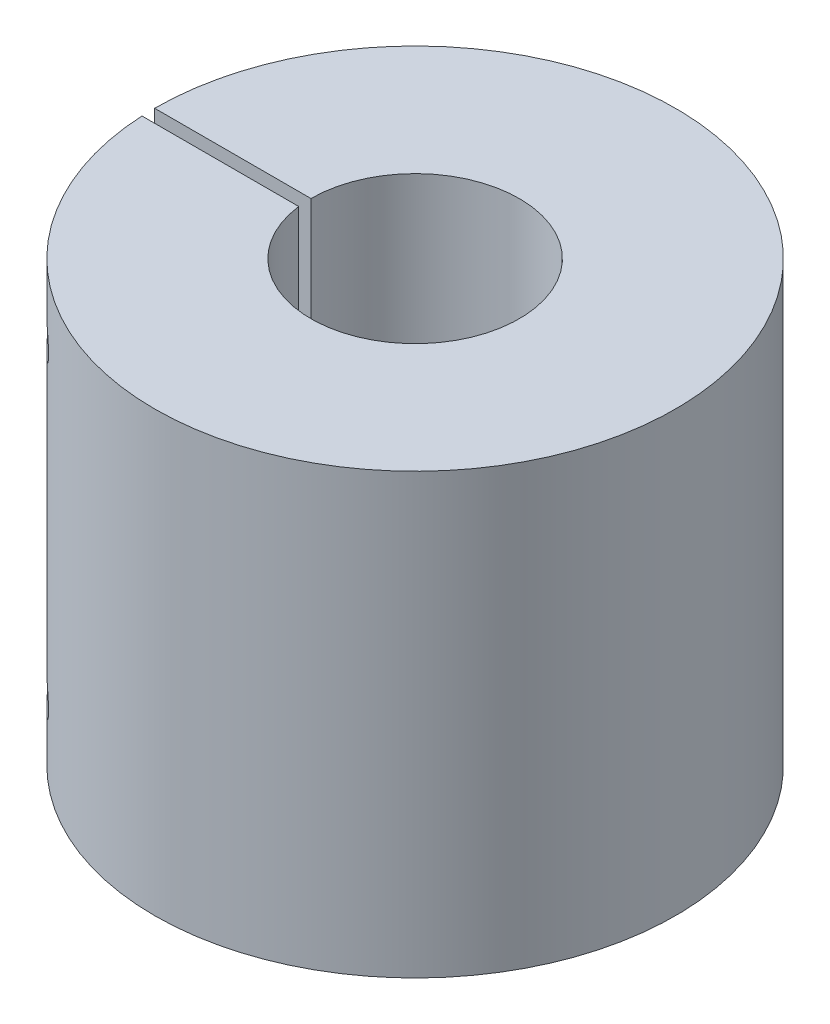
ISO-10303-21;
HEADER;
FILE_DESCRIPTION(('STEP AP214'),'2;1');
FILE_NAME('part.step','',(''),(''),'','','');
FILE_SCHEMA(('AUTOMOTIVE_DESIGN { 1 0 10303 214 1 1 1 1 }'));
ENDSEC;
DATA;
#1=APPLICATION_CONTEXT('core data for automotive mechanical design processes');
#2=APPLICATION_PROTOCOL_DEFINITION('international standard','automotive_design',2000,#1);
#3=PRODUCT_CONTEXT('',#1,'mechanical');
#4=PRODUCT('Part','Part','',(#3));
#5=PRODUCT_RELATED_PRODUCT_CATEGORY('part','',(#4));
#6=PRODUCT_DEFINITION_FORMATION('','',#4);
#7=PRODUCT_DEFINITION_CONTEXT('part definition',#1,'design');
#8=PRODUCT_DEFINITION('design','',#6,#7);
#9=PRODUCT_DEFINITION_SHAPE('','',#8);
#10=(LENGTH_UNIT() NAMED_UNIT(*) SI_UNIT(.MILLI.,.METRE.));
#11=(NAMED_UNIT(*) PLANE_ANGLE_UNIT() SI_UNIT($,.RADIAN.));
#12=(NAMED_UNIT(*) SI_UNIT($,.STERADIAN.) SOLID_ANGLE_UNIT());
#13=UNCERTAINTY_MEASURE_WITH_UNIT(LENGTH_MEASURE(1.E-05),#10,'distance_accuracy_value','');
#14=(GEOMETRIC_REPRESENTATION_CONTEXT(3) GLOBAL_UNCERTAINTY_ASSIGNED_CONTEXT((#13)) GLOBAL_UNIT_ASSIGNED_CONTEXT((#10,
#11,#12)) REPRESENTATION_CONTEXT('',''));
#15=CARTESIAN_POINT('',(0.,0.,0.));
#16=DIRECTION('',(0.,0.,1.));
#17=DIRECTION('',(1.,0.,0.));
#18=AXIS2_PLACEMENT_3D('',#15,#16,#17);
#19=CARTESIAN_POINT('',(0.,42.799,0.));
#20=DIRECTION('',(0.,-1.,0.));
#21=DIRECTION('',(0.,0.,-1.));
#22=AXIS2_PLACEMENT_3D('',#19,#20,#21);
#23=CYLINDRICAL_SURFACE('',#22,25.4);
#24=CARTESIAN_POINT('',(0.,42.799,0.));
#25=DIRECTION('',(0.,1.,0.));
#26=DIRECTION('',(0.,0.,1.));
#27=AXIS2_PLACEMENT_3D('',#24,#25,#26);
#28=CIRCLE('',#27,25.4);
#29=CARTESIAN_POINT('',(-25.3682301314065,42.799,1.26999999999999));
#30=VERTEX_POINT('',#29);
#31=CARTESIAN_POINT('',(-25.4,42.799,0.));
#32=VERTEX_POINT('',#31);
#33=EDGE_CURVE('E11',#30,#32,#28,.T.);
#34=ORIENTED_EDGE('',*,*,#33,.F.);
#35=DIRECTION('',(0.,1.,0.));
#36=VECTOR('',#35,1.);
#37=CARTESIAN_POINT('',(-25.3682301314065,0.,1.26999999999999));
#38=LINE('',#37,#36);
#39=CARTESIAN_POINT('',(-25.3682301314065,0.,1.26999999999999));
#40=VERTEX_POINT('',#39);
#41=EDGE_CURVE('E114',#40,#30,#38,.T.);
#42=ORIENTED_EDGE('',*,*,#41,.F.);
#43=CARTESIAN_POINT('',(0.,0.,0.));
#44=DIRECTION('',(0.,1.,0.));
#45=DIRECTION('',(0.,0.,1.));
#46=AXIS2_PLACEMENT_3D('',#43,#44,#45);
#47=CIRCLE('',#46,25.4);
#48=CARTESIAN_POINT('',(-25.4,0.,0.));
#49=VERTEX_POINT('',#48);
#50=EDGE_CURVE('E47',#40,#49,#47,.T.);
#51=ORIENTED_EDGE('',*,*,#50,.T.);
#52=DIRECTION('',(0.,1.,0.));
#53=VECTOR('',#52,1.);
#54=CARTESIAN_POINT('',(-25.4,0.,0.));
#55=LINE('',#54,#53);
#56=EDGE_CURVE('E55',#49,#32,#55,.T.);
#57=ORIENTED_EDGE('',*,*,#56,.T.);
#58=EDGE_LOOP('',(#34,#42,#51,#57));
#59=FACE_BOUND('',#58,.T.);
#60=CARTESIAN_POINT('',(-19.431,6.35,-16.358369081299));
#61=CARTESIAN_POINT('',(-19.4309944192309,6.42038913939797,-16.3583761695401));
#62=CARTESIAN_POINT('',(-19.4264439889854,6.49091727854745,-16.3637855273968));
#63=CARTESIAN_POINT('',(-19.4086961114471,6.629393930771,-16.3848311349153));
#64=CARTESIAN_POINT('',(-19.3954718971088,6.69733376747083,-16.4004990418976));
#65=CARTESIAN_POINT('',(-19.3617383549631,6.8279243577257,-16.4403087095693));
#66=CARTESIAN_POINT('',(-19.3413017627716,6.89062045682705,-16.4643658385845));
#67=CARTESIAN_POINT('',(-19.2944884436646,7.01051176344823,-16.5192015118006));
#68=CARTESIAN_POINT('',(-19.2681113963587,7.06770667403131,-16.5499804185287));
#69=CARTESIAN_POINT('',(-19.1956482468627,7.2046834228277,-16.6340471934122));
#70=CARTESIAN_POINT('',(-19.1464475588171,7.28073651162879,-16.6907149288399));
#71=CARTESIAN_POINT('',(-19.0402303673137,7.420205069082,-16.8117869073829));
#72=CARTESIAN_POINT('',(-18.9831926522795,7.48358505308802,-16.8762120860691));
#73=CARTESIAN_POINT('',(-18.8360987732611,7.62478463991348,-17.0404918015782));
#74=CARTESIAN_POINT('',(-18.7428365653432,7.69603217093641,-17.1431178761448));
#75=CARTESIAN_POINT('',(-18.5481810274297,7.8158679152501,-17.3535487328191));
#76=CARTESIAN_POINT('',(-18.446779835949,7.86443390402254,-17.461358480573));
#77=CARTESIAN_POINT('',(-18.235094658009,7.94114374480395,-17.6823479824953));
#78=CARTESIAN_POINT('',(-18.1246334252736,7.96861385756088,-17.7955909323108));
#79=CARTESIAN_POINT('',(-17.8999560332912,8.00053903546742,-18.0215691218348));
#80=CARTESIAN_POINT('',(-17.7857406063101,8.00499856239983,-18.1343044557346));
#81=CARTESIAN_POINT('',(-17.5596467157723,7.99002172557805,-18.3532772740552));
#82=CARTESIAN_POINT('',(-17.4478099761869,7.97134332368941,-18.459607312759));
#83=CARTESIAN_POINT('',(-17.2258493229759,7.90947484338186,-18.6668973843933));
#84=CARTESIAN_POINT('',(-17.1157237257143,7.86631066355189,-18.7678629681003));
#85=CARTESIAN_POINT('',(-16.9288771518189,7.76758094504546,-18.936333724112));
#86=CARTESIAN_POINT('',(-16.8507906206837,7.7179719468778,-19.0058125830254));
#87=CARTESIAN_POINT('',(-16.7006518099057,7.60288679689158,-19.1378724903426));
#88=CARTESIAN_POINT('',(-16.6285914588975,7.53743234148047,-19.2004628018765));
#89=CARTESIAN_POINT('',(-16.5081296460805,7.40563617126936,-19.3040569309257));
#90=CARTESIAN_POINT('',(-16.4579317419414,7.34234161853876,-19.3468378952065));
#91=CARTESIAN_POINT('',(-16.3657598787184,7.20585222915891,-19.4248691656344));
#92=CARTESIAN_POINT('',(-16.3237770010859,7.13266827644855,-19.4601276422838));
#93=CARTESIAN_POINT('',(-16.256074531184,6.98933309091186,-19.5167029362595));
#94=CARTESIAN_POINT('',(-16.2288532560677,6.92040973120477,-19.5393239387277));
#95=CARTESIAN_POINT('',(-16.1835790284205,6.77759902915757,-19.5768393880788));
#96=CARTESIAN_POINT('',(-16.1655218630934,6.70371398545375,-19.591737385341));
#97=CARTESIAN_POINT('',(-16.1396849864033,6.55263628161864,-19.6130277648507));
#98=CARTESIAN_POINT('',(-16.1319468931475,6.47543151603526,-19.619385704722));
#99=CARTESIAN_POINT('',(-16.1274465773323,6.32048792152384,-19.6230853320824));
#100=CARTESIAN_POINT('',(-16.1306825934868,6.24274918029455,-19.6204284663997));
#101=CARTESIAN_POINT('',(-16.1472796260072,6.09467702936974,-19.606770732272));
#102=CARTESIAN_POINT('',(-16.1599199569746,6.02420488756877,-19.5963637318054));
#103=CARTESIAN_POINT('',(-16.193720939138,5.88683041270956,-19.5684408863313));
#104=CARTESIAN_POINT('',(-16.2148821149417,5.81992829973658,-19.5509246036222));
#105=CARTESIAN_POINT('',(-16.2657608814974,5.6881092155345,-19.5086175332043));
#106=CARTESIAN_POINT('',(-16.2958252431192,5.62342261337431,-19.483530936649));
#107=CARTESIAN_POINT('',(-16.3626428900298,5.50040581072355,-19.4274502794792));
#108=CARTESIAN_POINT('',(-16.3993999636073,5.4420792402627,-19.3964528726851));
#109=CARTESIAN_POINT('',(-16.4949812829958,5.30894696313849,-19.3153042550792));
#110=CARTESIAN_POINT('',(-16.5565505216774,5.23765230430488,-19.2626071233538));
#111=CARTESIAN_POINT('',(-16.6870498956151,5.10915898676146,-19.149669969492));
#112=CARTESIAN_POINT('',(-16.7559942271395,5.05198824107243,-19.0894153601308));
#113=CARTESIAN_POINT('',(-16.9210744446752,4.93535044919927,-18.9434113532749));
#114=CARTESIAN_POINT('',(-17.0189194946431,4.88086426327358,-18.8556215127556));
#115=CARTESIAN_POINT('',(-17.2182728969005,4.79367972282534,-18.6737624070568));
#116=CARTESIAN_POINT('',(-17.3197853124399,4.76100636798178,-18.5796860722515));
#117=CARTESIAN_POINT('',(-17.5491642419944,4.7100093221386,-18.363480384219));
#118=CARTESIAN_POINT('',(-17.6772463574473,4.69735071467347,-18.2402396609507));
#119=CARTESIAN_POINT('',(-17.9306322431585,4.70099640365768,-17.9912243175881));
#120=CARTESIAN_POINT('',(-18.0559313026397,4.71734650446385,-17.8654460007544));
#121=CARTESIAN_POINT('',(-18.301658764021,4.77842890818427,-17.6136414250719));
#122=CARTESIAN_POINT('',(-18.4220374281642,4.82339839996128,-17.4876219539185));
#123=CARTESIAN_POINT('',(-18.5952187626611,4.91284251301635,-17.3027465166181));
#124=CARTESIAN_POINT('',(-18.6516856540409,4.94629769508168,-17.2418461102654));
#125=CARTESIAN_POINT('',(-18.7616491095533,5.02087332103941,-17.1221231293952));
#126=CARTESIAN_POINT('',(-18.815147685103,5.06198848989693,-17.0632991579064));
#127=CARTESIAN_POINT('',(-18.9265895522988,5.15943432243413,-16.939662702037));
#128=CARTESIAN_POINT('',(-18.983912116456,5.21714034515711,-16.8753598332947));
#129=CARTESIAN_POINT('',(-19.0919434609427,5.34424450593736,-16.7530392088177));
#130=CARTESIAN_POINT('',(-19.1426620694918,5.4136249087121,-16.6950121355577));
#131=CARTESIAN_POINT('',(-19.2241387520574,5.54697608906076,-16.6010665846287));
#132=CARTESIAN_POINT('',(-19.2567849152295,5.60837471546861,-16.5631593962992));
#133=CARTESIAN_POINT('',(-19.3151800185093,5.73838056044018,-16.4950244794823));
#134=CARTESIAN_POINT('',(-19.3409362963926,5.80698000075774,-16.4647885828001));
#135=CARTESIAN_POINT('',(-19.3794967176218,5.93642332807176,-16.4193733331422));
#136=CARTESIAN_POINT('',(-19.393846307626,5.99617650515103,-16.4024086142328));
#137=CARTESIAN_POINT('',(-19.4158601231343,6.11849261052838,-16.3763449726639));
#138=CARTESIAN_POINT('',(-19.4235431277185,6.18104712086391,-16.3672239557609));
#139=CARTESIAN_POINT('',(-19.4287308889301,6.26167392290131,-16.3610640514799));
#140=CARTESIAN_POINT('',(-19.4295804243227,6.27930980557605,-16.3600551862732));
#141=CARTESIAN_POINT('',(-19.4307157306884,6.31462752718393,-16.3587067516462));
#142=CARTESIAN_POINT('',(-19.4310014025928,6.33230937364638,-16.3583672998392));
#143=CARTESIAN_POINT('',(-19.431,6.35,-16.358369081299));
#144=B_SPLINE_CURVE_WITH_KNOTS('',3,(#60,#61,#62,#63,#64,#65,#66,#67,#68,#69,#70,#71,#72,#73,
#74,#75,#76,#77,#78,#79,#80,#81,#82,#83,#84,#85,#86,#87,#88,#89,#90,#91,#92,#93,#94,#95,#96,#97,
#98,#99,#100,#101,#102,#103,#104,#105,#106,#107,#108,#109,#110,#111,#112,#113,#114,#115,#116,
#117,#118,#119,#120,#121,#122,#123,#124,#125,#126,#127,#128,#129,#130,#131,#132,#133,#134,#135,
#136,#137,#138,#139,#140,#141,#142,#143),.UNSPECIFIED.,.T.,.F.,(4,2,2,2,2,2,2,2,2,2,2,2,2,2,2,2,
2,2,2,2,2,2,2,2,2,2,2,2,2,2,2,2,2,2,2,2,2,2,2,2,2,4),(0.,0.211077897864224,0.422810260209689,
0.632465640174069,0.842132330329687,1.16087368933245,1.48049539628029,1.94569905682483,
2.41135759592017,2.89133188003921,3.37121309301595,3.83578160341114,4.29985965378799,
4.6457672037496,4.99120377208246,5.26441220144226,5.53732235925553,5.76877852606434,
6.00012819448879,6.23240813121967,6.4646507900242,6.68072256077282,6.89680763656907,
7.12276576462904,7.34885219206898,7.67088478425751,7.99354880618227,8.41815223896184,
8.84324147797967,9.37509533949432,9.90778973857059,10.4449574823973,10.7132455878386,
10.9813496155824,11.2915429703924,11.6012692765505,11.8380747655534,12.0746270418278,
12.2651195654166,12.4550737329105,12.5081137950801,12.5611631753476),.UNSPECIFIED.);
#145=CARTESIAN_POINT('',(-19.431,6.35,-16.358369081299));
#146=VERTEX_POINT('',#145);
#147=EDGE_CURVE('E125',#146,#146,#144,.T.);
#148=ORIENTED_EDGE('',*,*,#147,.F.);
#149=EDGE_LOOP('',(#148));
#150=FACE_BOUND('',#149,.T.);
#151=CARTESIAN_POINT('',(-19.431,6.35,16.358369081299));
#152=CARTESIAN_POINT('',(-19.4309944192309,6.27961086060202,16.3583761695401));
#153=CARTESIAN_POINT('',(-19.4264439889854,6.20908272145255,16.3637855273968));
#154=CARTESIAN_POINT('',(-19.4086961114471,6.07060606922899,16.3848311349153));
#155=CARTESIAN_POINT('',(-19.3954718971088,6.00266623252916,16.4004990418976));
#156=CARTESIAN_POINT('',(-19.3617383549631,5.87207564227429,16.4403087095693));
#157=CARTESIAN_POINT('',(-19.3413017627716,5.80937954317294,16.4643658385845));
#158=CARTESIAN_POINT('',(-19.2944884436646,5.68948823655176,16.5192015118005));
#159=CARTESIAN_POINT('',(-19.2681113963587,5.63229332596868,16.5499804185287));
#160=CARTESIAN_POINT('',(-19.1956482468627,5.49531657717229,16.6340471934122));
#161=CARTESIAN_POINT('',(-19.1464475588171,5.4192634883712,16.6907149288399));
#162=CARTESIAN_POINT('',(-19.0402303673137,5.27979493091799,16.8117869073829));
#163=CARTESIAN_POINT('',(-18.9831926522795,5.21641494691197,16.8762120860691));
#164=CARTESIAN_POINT('',(-18.8360987732611,5.07521536008652,17.0404918015782));
#165=CARTESIAN_POINT('',(-18.7428365653432,5.00396782906358,17.1431178761448));
#166=CARTESIAN_POINT('',(-18.5481810274297,4.88413208474989,17.3535487328191));
#167=CARTESIAN_POINT('',(-18.446779835949,4.83556609597745,17.461358480573));
#168=CARTESIAN_POINT('',(-18.235094658009,4.75885625519604,17.6823479824953));
#169=CARTESIAN_POINT('',(-18.1246334252736,4.73138614243911,17.7955909323108));
#170=CARTESIAN_POINT('',(-17.8999560332912,4.69946096453257,18.0215691218348));
#171=CARTESIAN_POINT('',(-17.7857406063101,4.69500143760015,18.1343044557346));
#172=CARTESIAN_POINT('',(-17.5596467157723,4.70997827442194,18.3532772740552));
#173=CARTESIAN_POINT('',(-17.4478099761869,4.72865667631057,18.459607312759));
#174=CARTESIAN_POINT('',(-17.2258493229759,4.79052515661813,18.6668973843933));
#175=CARTESIAN_POINT('',(-17.1157237257143,4.8336893364481,18.7678629681003));
#176=CARTESIAN_POINT('',(-16.9288771518189,4.93241905495453,18.936333724112));
#177=CARTESIAN_POINT('',(-16.8507906206837,4.98202805312219,19.0058125830254));
#178=CARTESIAN_POINT('',(-16.7006518099057,5.09711320310841,19.1378724903426));
#179=CARTESIAN_POINT('',(-16.6285914588975,5.16256765851953,19.2004628018765));
#180=CARTESIAN_POINT('',(-16.5081296460805,5.29436382873063,19.3040569309257));
#181=CARTESIAN_POINT('',(-16.4579317419414,5.35765838146123,19.3468378952065));
#182=CARTESIAN_POINT('',(-16.3657598787184,5.49414777084108,19.4248691656344));
#183=CARTESIAN_POINT('',(-16.3237770010859,5.56733172355145,19.4601276422838));
#184=CARTESIAN_POINT('',(-16.256074531184,5.71066690908813,19.5167029362595));
#185=CARTESIAN_POINT('',(-16.2288532560677,5.77959026879522,19.5393239387277));
#186=CARTESIAN_POINT('',(-16.1835790284205,5.92240097084242,19.5768393880788));
#187=CARTESIAN_POINT('',(-16.1655218630934,5.99628601454625,19.591737385341));
#188=CARTESIAN_POINT('',(-16.1396849864033,6.14736371838135,19.6130277648507));
#189=CARTESIAN_POINT('',(-16.1319468931475,6.22456848396473,19.619385704722));
#190=CARTESIAN_POINT('',(-16.1274465773323,6.37951207847615,19.6230853320824));
#191=CARTESIAN_POINT('',(-16.1306825934868,6.45725081970544,19.6204284663997));
#192=CARTESIAN_POINT('',(-16.1472796260072,6.60532297063025,19.606770732272));
#193=CARTESIAN_POINT('',(-16.1599199569746,6.67579511243122,19.5963637318054));
#194=CARTESIAN_POINT('',(-16.193720939138,6.81316958729043,19.5684408863313));
#195=CARTESIAN_POINT('',(-16.2148821149417,6.88007170026341,19.5509246036222));
#196=CARTESIAN_POINT('',(-16.2657608814974,7.01189078446549,19.5086175332043));
#197=CARTESIAN_POINT('',(-16.2958252431192,7.07657738662568,19.483530936649));
#198=CARTESIAN_POINT('',(-16.3626428900298,7.19959418927644,19.4274502794792));
#199=CARTESIAN_POINT('',(-16.3993999636073,7.25792075973729,19.3964528726851));
#200=CARTESIAN_POINT('',(-16.4949812829958,7.3910530368615,19.3153042550792));
#201=CARTESIAN_POINT('',(-16.5565505216774,7.46234769569511,19.2626071233538));
#202=CARTESIAN_POINT('',(-16.6870498956151,7.59084101323854,19.149669969492));
#203=CARTESIAN_POINT('',(-16.7559942271395,7.64801175892756,19.0894153601308));
#204=CARTESIAN_POINT('',(-16.9210744446752,7.76464955080072,18.9434113532749));
#205=CARTESIAN_POINT('',(-17.0189194946431,7.81913573672641,18.8556215127556));
#206=CARTESIAN_POINT('',(-17.2182728969005,7.90632027717466,18.6737624070568));
#207=CARTESIAN_POINT('',(-17.3197853124399,7.93899363201821,18.5796860722515));
#208=CARTESIAN_POINT('',(-17.5491642419944,7.98999067786139,18.3634803842191));
#209=CARTESIAN_POINT('',(-17.6772463574473,8.00264928532652,18.2402396609507));
#210=CARTESIAN_POINT('',(-17.9306322431585,7.99900359634232,17.9912243175881));
#211=CARTESIAN_POINT('',(-18.0559313026397,7.98265349553614,17.8654460007544));
#212=CARTESIAN_POINT('',(-18.301658764021,7.92157109181572,17.6136414250719));
#213=CARTESIAN_POINT('',(-18.4220374281642,7.87660160003872,17.4876219539185));
#214=CARTESIAN_POINT('',(-18.5952187626611,7.78715748698365,17.3027465166181));
#215=CARTESIAN_POINT('',(-18.6516856540409,7.75370230491832,17.2418461102654));
#216=CARTESIAN_POINT('',(-18.7616491095533,7.67912667896058,17.1221231293952));
#217=CARTESIAN_POINT('',(-18.815147685103,7.63801151010306,17.0632991579064));
#218=CARTESIAN_POINT('',(-18.9265895522988,7.54056567756587,16.939662702037));
#219=CARTESIAN_POINT('',(-18.983912116456,7.48285965484288,16.8753598332947));
#220=CARTESIAN_POINT('',(-19.0919434609427,7.35575549406263,16.7530392088177));
#221=CARTESIAN_POINT('',(-19.1426620694918,7.28637509128789,16.6950121355577));
#222=CARTESIAN_POINT('',(-19.2241387520574,7.15302391093924,16.6010665846287));
#223=CARTESIAN_POINT('',(-19.2567849152295,7.09162528453139,16.5631593962992));
#224=CARTESIAN_POINT('',(-19.3151800185093,6.96161943955982,16.4950244794823));
#225=CARTESIAN_POINT('',(-19.3409362963926,6.89301999924225,16.4647885828001));
#226=CARTESIAN_POINT('',(-19.3794967176218,6.76357667192824,16.4193733331422));
#227=CARTESIAN_POINT('',(-19.393846307626,6.70382349484897,16.4024086142328));
#228=CARTESIAN_POINT('',(-19.4158601231343,6.58150738947162,16.3763449726639));
#229=CARTESIAN_POINT('',(-19.4235431277185,6.51895287913609,16.3672239557609));
#230=CARTESIAN_POINT('',(-19.4287308889301,6.43832607709869,16.3610640514799));
#231=CARTESIAN_POINT('',(-19.4295804243227,6.42069019442395,16.3600551862732));
#232=CARTESIAN_POINT('',(-19.4307157306884,6.38537247281606,16.3587067516462));
#233=CARTESIAN_POINT('',(-19.4310014025928,6.36769062635361,16.3583672998392));
#234=CARTESIAN_POINT('',(-19.431,6.35,16.358369081299));
#235=B_SPLINE_CURVE_WITH_KNOTS('',3,(#151,#152,#153,#154,#155,#156,#157,#158,#159,#160,#161,
#162,#163,#164,#165,#166,#167,#168,#169,#170,#171,#172,#173,#174,#175,#176,#177,#178,#179,#180,
#181,#182,#183,#184,#185,#186,#187,#188,#189,#190,#191,#192,#193,#194,#195,#196,#197,#198,#199,
#200,#201,#202,#203,#204,#205,#206,#207,#208,#209,#210,#211,#212,#213,#214,#215,#216,#217,#218,
#219,#220,#221,#222,#223,#224,#225,#226,#227,#228,#229,#230,#231,#232,#233,#234),.UNSPECIFIED.,
.T.,.F.,(4,2,2,2,2,2,2,2,2,2,2,2,2,2,2,2,2,2,2,2,2,2,2,2,2,2,2,2,2,2,2,2,2,2,2,2,2,2,2,2,2,4),
(0.,0.211077897864224,0.422810260209689,0.632465640174069,0.842132330329687,1.16087368933245,
1.48049539628029,1.94569905682483,2.41135759592017,2.89133188003921,3.37121309301595,
3.83578160341114,4.29985965378799,4.6457672037496,4.99120377208246,5.26441220144226,
5.53732235925553,5.76877852606434,6.0001281944888,6.23240813121967,6.4646507900242,
6.68072256077282,6.89680763656907,7.12276576462905,7.34885219206898,7.67088478425751,
7.99354880618227,8.41815223896184,8.84324147797967,9.37509533949431,9.90778973857058,
10.4449574823973,10.7132455878386,10.9813496155824,11.2915429703924,11.6012692765505,
11.8380747655534,12.0746270418278,12.2651195654166,12.4550737329105,12.5081137950801,
12.5611631753476),.UNSPECIFIED.);
#236=CARTESIAN_POINT('',(-19.431,6.35,16.358369081299));
#237=VERTEX_POINT('',#236);
#238=EDGE_CURVE('E130',#237,#237,#235,.T.);
#239=ORIENTED_EDGE('',*,*,#238,.F.);
#240=EDGE_LOOP('',(#239));
#241=FACE_BOUND('',#240,.T.);
#242=CARTESIAN_POINT('',(-19.431,36.449,-16.358369081299));
#243=CARTESIAN_POINT('',(-19.4309944192309,36.519389139398,-16.3583761695401));
#244=CARTESIAN_POINT('',(-19.4264439889854,36.5899172785474,-16.3637855273968));
#245=CARTESIAN_POINT('',(-19.4086961114471,36.728393930771,-16.3848311349153));
#246=CARTESIAN_POINT('',(-19.3954718971088,36.7963337674708,-16.4004990418976));
#247=CARTESIAN_POINT('',(-19.3617383549631,36.9269243577257,-16.4403087095693));
#248=CARTESIAN_POINT('',(-19.3413017627716,36.989620456827,-16.4643658385846));
#249=CARTESIAN_POINT('',(-19.2944884436646,37.1095117634482,-16.5192015118006));
#250=CARTESIAN_POINT('',(-19.2681113963587,37.1667066740313,-16.5499804185287));
#251=CARTESIAN_POINT('',(-19.1956482468627,37.3036834228277,-16.6340471934122));
#252=CARTESIAN_POINT('',(-19.1464475588171,37.3797365116288,-16.6907149288399));
#253=CARTESIAN_POINT('',(-19.0402303673137,37.519205069082,-16.8117869073829));
#254=CARTESIAN_POINT('',(-18.9831926522794,37.582585053088,-16.8762120860691));
#255=CARTESIAN_POINT('',(-18.8360987732611,37.7237846399135,-17.0404918015782));
#256=CARTESIAN_POINT('',(-18.7428365653432,37.7950321709364,-17.1431178761448));
#257=CARTESIAN_POINT('',(-18.5481810274297,37.9148679152501,-17.3535487328192));
#258=CARTESIAN_POINT('',(-18.446779835949,37.9634339040225,-17.461358480573));
#259=CARTESIAN_POINT('',(-18.235094658009,38.0401437448039,-17.6823479824953));
#260=CARTESIAN_POINT('',(-18.1246334252736,38.0676138575609,-17.7955909323108));
#261=CARTESIAN_POINT('',(-17.8999560332911,38.0995390354674,-18.0215691218348));
#262=CARTESIAN_POINT('',(-17.78574060631,38.1039985623998,-18.1343044557346));
#263=CARTESIAN_POINT('',(-17.5596467157723,38.089021725578,-18.3532772740552));
#264=CARTESIAN_POINT('',(-17.4478099761869,38.0703433236894,-18.459607312759));
#265=CARTESIAN_POINT('',(-17.2258493229759,38.0084748433818,-18.6668973843933));
#266=CARTESIAN_POINT('',(-17.1157237257143,37.9653106635519,-18.7678629681003));
#267=CARTESIAN_POINT('',(-16.9288771518189,37.8665809450454,-18.9363337241121));
#268=CARTESIAN_POINT('',(-16.8507906206836,37.8169719468778,-19.0058125830254));
#269=CARTESIAN_POINT('',(-16.7006518099057,37.7018867968916,-19.1378724903426));
#270=CARTESIAN_POINT('',(-16.6285914588975,37.6364323414805,-19.2004628018765));
#271=CARTESIAN_POINT('',(-16.5081296460805,37.5046361712693,-19.3040569309257));
#272=CARTESIAN_POINT('',(-16.4579317419414,37.4413416185387,-19.3468378952065));
#273=CARTESIAN_POINT('',(-16.3657598787184,37.3048522291589,-19.4248691656344));
#274=CARTESIAN_POINT('',(-16.3237770010859,37.2316682764485,-19.4601276422838));
#275=CARTESIAN_POINT('',(-16.2560745311839,37.0883330909118,-19.5167029362595));
#276=CARTESIAN_POINT('',(-16.2288532560677,37.0194097312047,-19.5393239387277));
#277=CARTESIAN_POINT('',(-16.1835790284205,36.8765990291576,-19.5768393880788));
#278=CARTESIAN_POINT('',(-16.1655218630934,36.8027139854537,-19.591737385341));
#279=CARTESIAN_POINT('',(-16.1396849864033,36.6516362816186,-19.6130277648507));
#280=CARTESIAN_POINT('',(-16.1319468931475,36.5744315160352,-19.619385704722));
#281=CARTESIAN_POINT('',(-16.1274465773323,36.4194879215238,-19.6230853320824));
#282=CARTESIAN_POINT('',(-16.1306825934868,36.3417491802945,-19.6204284663997));
#283=CARTESIAN_POINT('',(-16.1472796260072,36.1936770293697,-19.606770732272));
#284=CARTESIAN_POINT('',(-16.1599199569746,36.1232048875687,-19.5963637318053));
#285=CARTESIAN_POINT('',(-16.193720939138,35.9858304127095,-19.5684408863313));
#286=CARTESIAN_POINT('',(-16.2148821149417,35.9189282997365,-19.5509246036222));
#287=CARTESIAN_POINT('',(-16.2657608814974,35.7871092155345,-19.5086175332043));
#288=CARTESIAN_POINT('',(-16.2958252431192,35.7224226133743,-19.483530936649));
#289=CARTESIAN_POINT('',(-16.3626428900299,35.5994058107235,-19.4274502794792));
#290=CARTESIAN_POINT('',(-16.3993999636074,35.5410792402627,-19.3964528726851));
#291=CARTESIAN_POINT('',(-16.4949812829958,35.4079469631385,-19.3153042550792));
#292=CARTESIAN_POINT('',(-16.5565505216774,35.3366523043049,-19.2626071233538));
#293=CARTESIAN_POINT('',(-16.6870498956151,35.2081589867614,-19.149669969492));
#294=CARTESIAN_POINT('',(-16.7559942271395,35.1509882410724,-19.0894153601308));
#295=CARTESIAN_POINT('',(-16.9210744446752,35.0343504491993,-18.9434113532749));
#296=CARTESIAN_POINT('',(-17.0189194946431,34.9798642632736,-18.8556215127556));
#297=CARTESIAN_POINT('',(-17.2182728969005,34.8926797228253,-18.6737624070568));
#298=CARTESIAN_POINT('',(-17.3197853124399,34.8600063679818,-18.5796860722515));
#299=CARTESIAN_POINT('',(-17.5491642419944,34.8090093221386,-18.363480384219));
#300=CARTESIAN_POINT('',(-17.6772463574473,34.7963507146735,-18.2402396609507));
#301=CARTESIAN_POINT('',(-17.9306322431585,34.7999964036577,-17.9912243175881));
#302=CARTESIAN_POINT('',(-18.0559313026397,34.8163465044639,-17.8654460007544));
#303=CARTESIAN_POINT('',(-18.301658764021,34.8774289081843,-17.6136414250719));
#304=CARTESIAN_POINT('',(-18.4220374281643,34.9223983999613,-17.4876219539185));
#305=CARTESIAN_POINT('',(-18.5952187626611,35.0118425130164,-17.3027465166181));
#306=CARTESIAN_POINT('',(-18.6516856540409,35.0452976950817,-17.2418461102654));
#307=CARTESIAN_POINT('',(-18.7616491095533,35.1198733210394,-17.1221231293952));
#308=CARTESIAN_POINT('',(-18.815147685103,35.1609884898969,-17.0632991579064));
#309=CARTESIAN_POINT('',(-18.9265895522988,35.2584343224341,-16.939662702037));
#310=CARTESIAN_POINT('',(-18.983912116456,35.3161403451571,-16.8753598332947));
#311=CARTESIAN_POINT('',(-19.0919434609427,35.4432445059374,-16.7530392088177));
#312=CARTESIAN_POINT('',(-19.1426620694918,35.5126249087121,-16.6950121355577));
#313=CARTESIAN_POINT('',(-19.2241387520574,35.6459760890608,-16.6010665846287));
#314=CARTESIAN_POINT('',(-19.2567849152295,35.7073747154686,-16.5631593962992));
#315=CARTESIAN_POINT('',(-19.3151800185093,35.8373805604402,-16.4950244794823));
#316=CARTESIAN_POINT('',(-19.3409362963926,35.9059800007577,-16.4647885828001));
#317=CARTESIAN_POINT('',(-19.3794967176218,36.0354233280718,-16.4193733331422));
#318=CARTESIAN_POINT('',(-19.393846307626,36.095176505151,-16.4024086142328));
#319=CARTESIAN_POINT('',(-19.4158601231343,36.2174926105284,-16.3763449726639));
#320=CARTESIAN_POINT('',(-19.4235431277185,36.2800471208639,-16.3672239557609));
#321=CARTESIAN_POINT('',(-19.4287308889301,36.3606739229013,-16.3610640514799));
#322=CARTESIAN_POINT('',(-19.4295804243227,36.378309805576,-16.3600551862732));
#323=CARTESIAN_POINT('',(-19.4307157306884,36.4136275271839,-16.3587067516462));
#324=CARTESIAN_POINT('',(-19.4310014025928,36.4313093736464,-16.3583672998392));
#325=CARTESIAN_POINT('',(-19.431,36.449,-16.358369081299));
#326=B_SPLINE_CURVE_WITH_KNOTS('',3,(#242,#243,#244,#245,#246,#247,#248,#249,#250,#251,#252,
#253,#254,#255,#256,#257,#258,#259,#260,#261,#262,#263,#264,#265,#266,#267,#268,#269,#270,#271,
#272,#273,#274,#275,#276,#277,#278,#279,#280,#281,#282,#283,#284,#285,#286,#287,#288,#289,#290,
#291,#292,#293,#294,#295,#296,#297,#298,#299,#300,#301,#302,#303,#304,#305,#306,#307,#308,#309,
#310,#311,#312,#313,#314,#315,#316,#317,#318,#319,#320,#321,#322,#323,#324,#325),.UNSPECIFIED.,
.T.,.F.,(4,2,2,2,2,2,2,2,2,2,2,2,2,2,2,2,2,2,2,2,2,2,2,2,2,2,2,2,2,2,2,2,2,2,2,2,2,2,2,2,2,4),
(0.,0.211077897864219,0.422810260209689,0.632465640174072,0.842132330329692,1.16087368933245,
1.48049539628029,1.94569905682483,2.41135759592018,2.89133188003922,3.37121309301595,
3.83578160341114,4.29985965378799,4.6457672037496,4.99120377208246,5.26441220144225,
5.53732235925552,5.76877852606433,6.00012819448879,6.23240813121968,6.4646507900242,
6.68072256077282,6.89680763656907,7.12276576462905,7.34885219206898,7.67088478425751,
7.99354880618227,8.41815223896184,8.84324147797967,9.37509533949432,9.90778973857058,
10.4449574823973,10.7132455878386,10.9813496155824,11.2915429703923,11.6012692765505,
11.8380747655534,12.0746270418277,12.2651195654166,12.4550737329105,12.5081137950801,
12.5611631753476),.UNSPECIFIED.);
#327=CARTESIAN_POINT('',(-19.431,36.449,-16.358369081299));
#328=VERTEX_POINT('',#327);
#329=EDGE_CURVE('E180',#328,#328,#326,.T.);
#330=ORIENTED_EDGE('',*,*,#329,.F.);
#331=EDGE_LOOP('',(#330));
#332=FACE_BOUND('',#331,.T.);
#333=CARTESIAN_POINT('',(-19.431,36.449,16.358369081299));
#334=CARTESIAN_POINT('',(-19.4309944192309,36.378610860602,16.3583761695401));
#335=CARTESIAN_POINT('',(-19.4264439889854,36.3080827214525,16.3637855273968));
#336=CARTESIAN_POINT('',(-19.4086961114471,36.169606069229,16.3848311349153));
#337=CARTESIAN_POINT('',(-19.3954718971088,36.1016662325292,16.4004990418976));
#338=CARTESIAN_POINT('',(-19.3617383549631,35.9710756422743,16.4403087095693));
#339=CARTESIAN_POINT('',(-19.3413017627716,35.9083795431729,16.4643658385846));
#340=CARTESIAN_POINT('',(-19.2944884436646,35.7884882365517,16.5192015118006));
#341=CARTESIAN_POINT('',(-19.2681113963587,35.7312933259687,16.5499804185287));
#342=CARTESIAN_POINT('',(-19.1956482468627,35.5943165771723,16.6340471934122));
#343=CARTESIAN_POINT('',(-19.1464475588171,35.5182634883712,16.6907149288399));
#344=CARTESIAN_POINT('',(-19.0402303673137,35.378794930918,16.8117869073829));
#345=CARTESIAN_POINT('',(-18.9831926522794,35.315414946912,16.8762120860691));
#346=CARTESIAN_POINT('',(-18.8360987732611,35.1742153600865,17.0404918015782));
#347=CARTESIAN_POINT('',(-18.7428365653432,35.1029678290636,17.1431178761448));
#348=CARTESIAN_POINT('',(-18.5481810274297,34.9831320847499,17.3535487328192));
#349=CARTESIAN_POINT('',(-18.446779835949,34.9345660959774,17.461358480573));
#350=CARTESIAN_POINT('',(-18.235094658009,34.857856255196,17.6823479824953));
#351=CARTESIAN_POINT('',(-18.1246334252736,34.8303861424391,17.7955909323108));
#352=CARTESIAN_POINT('',(-17.8999560332911,34.7984609645326,18.0215691218348));
#353=CARTESIAN_POINT('',(-17.78574060631,34.7940014376002,18.1343044557346));
#354=CARTESIAN_POINT('',(-17.5596467157723,34.8089782744219,18.3532772740552));
#355=CARTESIAN_POINT('',(-17.4478099761869,34.8276566763106,18.459607312759));
#356=CARTESIAN_POINT('',(-17.2258493229759,34.8895251566181,18.6668973843933));
#357=CARTESIAN_POINT('',(-17.1157237257143,34.9326893364481,18.7678629681003));
#358=CARTESIAN_POINT('',(-16.9288771518189,35.0314190549545,18.9363337241121));
#359=CARTESIAN_POINT('',(-16.8507906206836,35.0810280531222,19.0058125830254));
#360=CARTESIAN_POINT('',(-16.7006518099057,35.1961132031084,19.1378724903426));
#361=CARTESIAN_POINT('',(-16.6285914588975,35.2615676585195,19.2004628018765));
#362=CARTESIAN_POINT('',(-16.5081296460805,35.3933638287306,19.3040569309257));
#363=CARTESIAN_POINT('',(-16.4579317419414,35.4566583814612,19.3468378952065));
#364=CARTESIAN_POINT('',(-16.3657598787184,35.5931477708411,19.4248691656344));
#365=CARTESIAN_POINT('',(-16.3237770010859,35.6663317235515,19.4601276422838));
#366=CARTESIAN_POINT('',(-16.2560745311839,35.8096669090881,19.5167029362595));
#367=CARTESIAN_POINT('',(-16.2288532560677,35.8785902687952,19.5393239387277));
#368=CARTESIAN_POINT('',(-16.1835790284205,36.0214009708424,19.5768393880788));
#369=CARTESIAN_POINT('',(-16.1655218630934,36.0952860145463,19.591737385341));
#370=CARTESIAN_POINT('',(-16.1396849864033,36.2463637183814,19.6130277648507));
#371=CARTESIAN_POINT('',(-16.1319468931475,36.3235684839647,19.619385704722));
#372=CARTESIAN_POINT('',(-16.1274465773323,36.4785120784762,19.6230853320824));
#373=CARTESIAN_POINT('',(-16.1306825934868,36.5562508197054,19.6204284663997));
#374=CARTESIAN_POINT('',(-16.1472796260072,36.7043229706303,19.606770732272));
#375=CARTESIAN_POINT('',(-16.1599199569746,36.7747951124312,19.5963637318053));
#376=CARTESIAN_POINT('',(-16.193720939138,36.9121695872904,19.5684408863313));
#377=CARTESIAN_POINT('',(-16.2148821149417,36.9790717002634,19.5509246036222));
#378=CARTESIAN_POINT('',(-16.2657608814974,37.1108907844655,19.5086175332043));
#379=CARTESIAN_POINT('',(-16.2958252431192,37.1755773866257,19.483530936649));
#380=CARTESIAN_POINT('',(-16.3626428900299,37.2985941892764,19.4274502794792));
#381=CARTESIAN_POINT('',(-16.3993999636074,37.3569207597373,19.3964528726851));
#382=CARTESIAN_POINT('',(-16.4949812829958,37.4900530368615,19.3153042550792));
#383=CARTESIAN_POINT('',(-16.5565505216774,37.5613476956951,19.2626071233538));
#384=CARTESIAN_POINT('',(-16.6870498956151,37.6898410132385,19.149669969492));
#385=CARTESIAN_POINT('',(-16.7559942271395,37.7470117589276,19.0894153601308));
#386=CARTESIAN_POINT('',(-16.9210744446752,37.8636495508007,18.9434113532749));
#387=CARTESIAN_POINT('',(-17.0189194946431,37.9181357367264,18.8556215127556));
#388=CARTESIAN_POINT('',(-17.2182728969005,38.0053202771747,18.6737624070568));
#389=CARTESIAN_POINT('',(-17.3197853124399,38.0379936320182,18.5796860722515));
#390=CARTESIAN_POINT('',(-17.5491642419944,38.0889906778614,18.363480384219));
#391=CARTESIAN_POINT('',(-17.6772463574473,38.1016492853265,18.2402396609507));
#392=CARTESIAN_POINT('',(-17.9306322431585,38.0980035963423,17.9912243175881));
#393=CARTESIAN_POINT('',(-18.0559313026397,38.0816534955361,17.8654460007544));
#394=CARTESIAN_POINT('',(-18.301658764021,38.0205710918157,17.6136414250719));
#395=CARTESIAN_POINT('',(-18.4220374281643,37.9756016000387,17.4876219539185));
#396=CARTESIAN_POINT('',(-18.5952187626611,37.8861574869836,17.3027465166181));
#397=CARTESIAN_POINT('',(-18.6516856540409,37.8527023049183,17.2418461102654));
#398=CARTESIAN_POINT('',(-18.7616491095533,37.7781266789606,17.1221231293952));
#399=CARTESIAN_POINT('',(-18.815147685103,37.737011510103,17.0632991579064));
#400=CARTESIAN_POINT('',(-18.9265895522988,37.6395656775658,16.939662702037));
#401=CARTESIAN_POINT('',(-18.983912116456,37.5818596548429,16.8753598332947));
#402=CARTESIAN_POINT('',(-19.0919434609427,37.4547554940626,16.7530392088177));
#403=CARTESIAN_POINT('',(-19.1426620694918,37.3853750912879,16.6950121355577));
#404=CARTESIAN_POINT('',(-19.2241387520574,37.2520239109392,16.6010665846287));
#405=CARTESIAN_POINT('',(-19.2567849152295,37.1906252845314,16.5631593962992));
#406=CARTESIAN_POINT('',(-19.3151800185093,37.0606194395598,16.4950244794823));
#407=CARTESIAN_POINT('',(-19.3409362963926,36.9920199992422,16.4647885828001));
#408=CARTESIAN_POINT('',(-19.3794967176218,36.8625766719282,16.4193733331422));
#409=CARTESIAN_POINT('',(-19.393846307626,36.802823494849,16.4024086142328));
#410=CARTESIAN_POINT('',(-19.4158601231343,36.6805073894716,16.3763449726639));
#411=CARTESIAN_POINT('',(-19.4235431277185,36.6179528791361,16.3672239557609));
#412=CARTESIAN_POINT('',(-19.4287308889301,36.5373260770987,16.3610640514799));
#413=CARTESIAN_POINT('',(-19.4295804243227,36.5196901944239,16.3600551862732));
#414=CARTESIAN_POINT('',(-19.4307157306884,36.4843724728161,16.3587067516462));
#415=CARTESIAN_POINT('',(-19.4310014025928,36.4666906263536,16.3583672998392));
#416=CARTESIAN_POINT('',(-19.431,36.449,16.358369081299));
#417=B_SPLINE_CURVE_WITH_KNOTS('',3,(#333,#334,#335,#336,#337,#338,#339,#340,#341,#342,#343,
#344,#345,#346,#347,#348,#349,#350,#351,#352,#353,#354,#355,#356,#357,#358,#359,#360,#361,#362,
#363,#364,#365,#366,#367,#368,#369,#370,#371,#372,#373,#374,#375,#376,#377,#378,#379,#380,#381,
#382,#383,#384,#385,#386,#387,#388,#389,#390,#391,#392,#393,#394,#395,#396,#397,#398,#399,#400,
#401,#402,#403,#404,#405,#406,#407,#408,#409,#410,#411,#412,#413,#414,#415,#416),.UNSPECIFIED.,
.T.,.F.,(4,2,2,2,2,2,2,2,2,2,2,2,2,2,2,2,2,2,2,2,2,2,2,2,2,2,2,2,2,2,2,2,2,2,2,2,2,2,2,2,2,4),
(0.,0.211077897864219,0.422810260209689,0.632465640174072,0.842132330329692,1.16087368933245,
1.48049539628029,1.94569905682483,2.41135759592018,2.89133188003922,3.37121309301595,
3.83578160341114,4.29985965378799,4.6457672037496,4.99120377208246,5.26441220144225,
5.53732235925552,5.76877852606433,6.00012819448879,6.23240813121967,6.4646507900242,
6.68072256077282,6.89680763656907,7.12276576462905,7.34885219206898,7.67088478425751,
7.99354880618227,8.41815223896185,8.84324147797967,9.37509533949432,9.90778973857059,
10.4449574823973,10.7132455878386,10.9813496155824,11.2915429703924,11.6012692765505,
11.8380747655534,12.0746270418277,12.2651195654166,12.4550737329105,12.5081137950801,
12.5611631753476),.UNSPECIFIED.);
#418=CARTESIAN_POINT('',(-19.431,36.449,16.358369081299));
#419=VERTEX_POINT('',#418);
#420=EDGE_CURVE('E103',#419,#419,#417,.T.);
#421=ORIENTED_EDGE('',*,*,#420,.F.);
#422=EDGE_LOOP('',(#421));
#423=FACE_BOUND('',#422,.T.);
#424=ADVANCED_FACE('F37',(#59,#150,#241,#332,#423),#23,.T.);
#425=CARTESIAN_POINT('',(0.,42.799,0.));
#426=DIRECTION('',(0.,1.,0.));
#427=DIRECTION('',(0.,0.,1.));
#428=AXIS2_PLACEMENT_3D('',#425,#426,#427);
#429=PLANE('',#428);
#430=DIRECTION('',(1.,0.,0.));
#431=VECTOR('',#430,1.);
#432=CARTESIAN_POINT('',(-10.0803124951561,42.799,1.27));
#433=LINE('',#432,#431);
#434=CARTESIAN_POINT('',(-10.0803124951561,42.799,1.27));
#435=VERTEX_POINT('',#434);
#436=EDGE_CURVE('E98',#30,#435,#433,.T.);
#437=ORIENTED_EDGE('',*,*,#436,.F.);
#438=ORIENTED_EDGE('',*,*,#33,.T.);
#439=DIRECTION('',(-1.,0.,0.));
#440=VECTOR('',#439,1.);
#441=CARTESIAN_POINT('',(-10.16,42.799,0.));
#442=LINE('',#441,#440);
#443=CARTESIAN_POINT('',(-10.16,42.799,0.));
#444=VERTEX_POINT('',#443);
#445=EDGE_CURVE('E100',#444,#32,#442,.T.);
#446=ORIENTED_EDGE('',*,*,#445,.F.);
#447=CARTESIAN_POINT('',(0.,42.799,0.));
#448=DIRECTION('',(0.,1.,0.));
#449=DIRECTION('',(0.,0.,-1.));
#450=AXIS2_PLACEMENT_3D('',#447,#448,#449);
#451=CIRCLE('',#450,10.16);
#452=EDGE_CURVE('E87',#435,#444,#451,.T.);
#453=ORIENTED_EDGE('',*,*,#452,.F.);
#454=EDGE_LOOP('',(#437,#438,#446,#453));
#455=FACE_BOUND('',#454,.T.);
#456=ADVANCED_FACE('F159',(#455),#429,.T.);
#457=CARTESIAN_POINT('',(0.,0.,0.));
#458=DIRECTION('',(0.,1.,0.));
#459=DIRECTION('',(0.,0.,1.));
#460=AXIS2_PLACEMENT_3D('',#457,#458,#459);
#461=PLANE('',#460);
#462=ORIENTED_EDGE('',*,*,#50,.F.);
#463=DIRECTION('',(1.,0.,0.));
#464=VECTOR('',#463,1.);
#465=CARTESIAN_POINT('',(-10.0803124951561,0.,1.27));
#466=LINE('',#465,#464);
#467=CARTESIAN_POINT('',(-10.0803124951561,0.,1.27));
#468=VERTEX_POINT('',#467);
#469=EDGE_CURVE('E89',#40,#468,#466,.T.);
#470=ORIENTED_EDGE('',*,*,#469,.T.);
#471=CARTESIAN_POINT('',(0.,0.,0.));
#472=DIRECTION('',(0.,1.,0.));
#473=DIRECTION('',(0.,0.,-1.));
#474=AXIS2_PLACEMENT_3D('',#471,#472,#473);
#475=CIRCLE('',#474,10.16);
#476=CARTESIAN_POINT('',(-10.16,0.,0.));
#477=VERTEX_POINT('',#476);
#478=EDGE_CURVE('E84',#468,#477,#475,.T.);
#479=ORIENTED_EDGE('',*,*,#478,.T.);
#480=DIRECTION('',(-1.,0.,0.));
#481=VECTOR('',#480,1.);
#482=CARTESIAN_POINT('',(-10.16,0.,0.));
#483=LINE('',#482,#481);
#484=EDGE_CURVE('E91',#477,#49,#483,.T.);
#485=ORIENTED_EDGE('',*,*,#484,.T.);
#486=EDGE_LOOP('',(#462,#470,#479,#485));
#487=FACE_BOUND('',#486,.T.);
#488=ADVANCED_FACE('F97',(#487),#461,.F.);
#489=CARTESIAN_POINT('',(0.,0.,0.));
#490=DIRECTION('',(0.,1.,0.));
#491=DIRECTION('',(0.,0.,1.));
#492=AXIS2_PLACEMENT_3D('',#489,#490,#491);
#493=CYLINDRICAL_SURFACE('',#492,10.16);
#494=ORIENTED_EDGE('',*,*,#452,.T.);
#495=DIRECTION('',(0.,1.,0.));
#496=VECTOR('',#495,1.);
#497=CARTESIAN_POINT('',(-10.16,0.,0.));
#498=LINE('',#497,#496);
#499=EDGE_CURVE('E81',#477,#444,#498,.T.);
#500=ORIENTED_EDGE('',*,*,#499,.F.);
#501=ORIENTED_EDGE('',*,*,#478,.F.);
#502=DIRECTION('',(0.,1.,0.));
#503=VECTOR('',#502,1.);
#504=CARTESIAN_POINT('',(-10.0803124951561,0.,1.27));
#505=LINE('',#504,#503);
#506=EDGE_CURVE('E64',#468,#435,#505,.T.);
#507=ORIENTED_EDGE('',*,*,#506,.T.);
#508=EDGE_LOOP('',(#494,#500,#501,#507));
#509=FACE_BOUND('',#508,.T.);
#510=ADVANCED_FACE('F82',(#509),#493,.F.);
#511=CARTESIAN_POINT('',(-10.0803124951561,0.,1.27));
#512=DIRECTION('',(0.,0.,1.));
#513=DIRECTION('',(1.,0.,0.));
#514=AXIS2_PLACEMENT_3D('',#511,#512,#513);
#515=PLANE('',#514);
#516=CARTESIAN_POINT('',(-17.78,36.449,1.27));
#517=DIRECTION('',(0.,0.,1.));
#518=DIRECTION('',(1.,0.,0.));
#519=AXIS2_PLACEMENT_3D('',#516,#517,#518);
#520=CIRCLE('',#519,1.65099999999999);
#521=CARTESIAN_POINT('',(-16.129,36.449,1.27));
#522=VERTEX_POINT('',#521);
#523=EDGE_CURVE('E185',#522,#522,#520,.F.);
#524=ORIENTED_EDGE('',*,*,#523,.F.);
#525=EDGE_LOOP('',(#524));
#526=FACE_BOUND('',#525,.T.);
#527=CARTESIAN_POINT('',(-17.78,6.35,1.27));
#528=DIRECTION('',(0.,0.,1.));
#529=DIRECTION('',(1.,0.,0.));
#530=AXIS2_PLACEMENT_3D('',#527,#528,#529);
#531=CIRCLE('',#530,1.651);
#532=CARTESIAN_POINT('',(-16.129,6.35,1.27));
#533=VERTEX_POINT('',#532);
#534=EDGE_CURVE('E121',#533,#533,#531,.F.);
#535=ORIENTED_EDGE('',*,*,#534,.F.);
#536=EDGE_LOOP('',(#535));
#537=FACE_BOUND('',#536,.T.);
#538=ORIENTED_EDGE('',*,*,#436,.T.);
#539=ORIENTED_EDGE('',*,*,#506,.F.);
#540=ORIENTED_EDGE('',*,*,#469,.F.);
#541=ORIENTED_EDGE('',*,*,#41,.T.);
#542=EDGE_LOOP('',(#538,#539,#540,#541));
#543=FACE_BOUND('',#542,.T.);
#544=ADVANCED_FACE('F149',(#526,#537,#543),#515,.F.);
#545=CARTESIAN_POINT('',(-10.16,0.,0.));
#546=DIRECTION('',(0.,0.,-1.));
#547=DIRECTION('',(-1.,0.,0.));
#548=AXIS2_PLACEMENT_3D('',#545,#546,#547);
#549=PLANE('',#548);
#550=CARTESIAN_POINT('',(-17.78,36.449,0.));
#551=DIRECTION('',(0.,0.,-1.));
#552=DIRECTION('',(-1.,0.,0.));
#553=AXIS2_PLACEMENT_3D('',#550,#551,#552);
#554=CIRCLE('',#553,1.65099999999999);
#555=CARTESIAN_POINT('',(-19.431,36.449,0.));
#556=VERTEX_POINT('',#555);
#557=EDGE_CURVE('E41',#556,#556,#554,.F.);
#558=ORIENTED_EDGE('',*,*,#557,.F.);
#559=EDGE_LOOP('',(#558));
#560=FACE_BOUND('',#559,.T.);
#561=CARTESIAN_POINT('',(-17.78,6.35,0.));
#562=DIRECTION('',(0.,0.,-1.));
#563=DIRECTION('',(-1.,0.,0.));
#564=AXIS2_PLACEMENT_3D('',#561,#562,#563);
#565=CIRCLE('',#564,1.651);
#566=CARTESIAN_POINT('',(-19.431,6.35,0.));
#567=VERTEX_POINT('',#566);
#568=EDGE_CURVE('E119',#567,#567,#565,.F.);
#569=ORIENTED_EDGE('',*,*,#568,.F.);
#570=EDGE_LOOP('',(#569));
#571=FACE_BOUND('',#570,.T.);
#572=ORIENTED_EDGE('',*,*,#445,.T.);
#573=ORIENTED_EDGE('',*,*,#56,.F.);
#574=ORIENTED_EDGE('',*,*,#484,.F.);
#575=ORIENTED_EDGE('',*,*,#499,.T.);
#576=EDGE_LOOP('',(#572,#573,#574,#575));
#577=FACE_BOUND('',#576,.T.);
#578=ADVANCED_FACE('F92',(#560,#571,#577),#549,.F.);
#579=CARTESIAN_POINT('',(-17.78,6.35,25.4));
#580=DIRECTION('',(0.,0.,-1.));
#581=DIRECTION('',(-1.,0.,0.));
#582=AXIS2_PLACEMENT_3D('',#579,#580,#581);
#583=CYLINDRICAL_SURFACE('',#582,1.651);
#584=ORIENTED_EDGE('',*,*,#568,.T.);
#585=EDGE_LOOP('',(#584));
#586=FACE_BOUND('',#585,.T.);
#587=ORIENTED_EDGE('',*,*,#147,.T.);
#588=EDGE_LOOP('',(#587));
#589=FACE_BOUND('',#588,.T.);
#590=ADVANCED_FACE('F147',(#586,#589),#583,.F.);
#591=CARTESIAN_POINT('',(-17.78,36.449,25.4));
#592=DIRECTION('',(0.,0.,-1.));
#593=DIRECTION('',(-1.,0.,0.));
#594=AXIS2_PLACEMENT_3D('',#591,#592,#593);
#595=CYLINDRICAL_SURFACE('',#594,1.65099999999999);
#596=ORIENTED_EDGE('',*,*,#557,.T.);
#597=EDGE_LOOP('',(#596));
#598=FACE_BOUND('',#597,.T.);
#599=ORIENTED_EDGE('',*,*,#329,.T.);
#600=EDGE_LOOP('',(#599));
#601=FACE_BOUND('',#600,.T.);
#602=ADVANCED_FACE('F146',(#598,#601),#595,.F.);
#603=ORIENTED_EDGE('',*,*,#534,.T.);
#604=EDGE_LOOP('',(#603));
#605=FACE_BOUND('',#604,.T.);
#606=ORIENTED_EDGE('',*,*,#238,.T.);
#607=EDGE_LOOP('',(#606));
#608=FACE_BOUND('',#607,.T.);
#609=ADVANCED_FACE('F141',(#605,#608),#583,.F.);
#610=ORIENTED_EDGE('',*,*,#523,.T.);
#611=EDGE_LOOP('',(#610));
#612=FACE_BOUND('',#611,.T.);
#613=ORIENTED_EDGE('',*,*,#420,.T.);
#614=EDGE_LOOP('',(#613));
#615=FACE_BOUND('',#614,.T.);
#616=ADVANCED_FACE('F145',(#612,#615),#595,.F.);
#617=CLOSED_SHELL('',(#424,#456,#488,#510,#544,#578,#590,#602,#609,#616));
#618=MANIFOLD_SOLID_BREP('B2',#617);
#619=ADVANCED_BREP_SHAPE_REPRESENTATION('',(#18,#618),#14);
#620=SHAPE_DEFINITION_REPRESENTATION(#9,#619);
ENDSEC;
END-ISO-10303-21;
